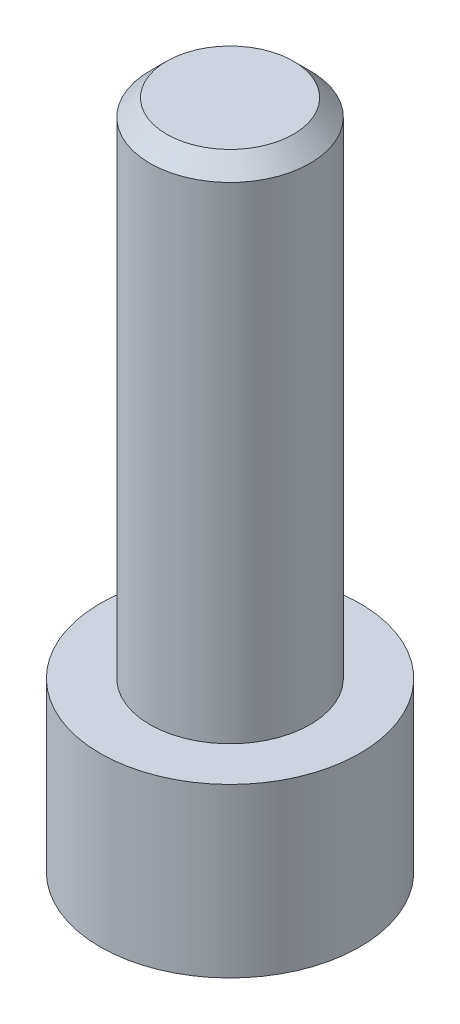
ISO-10303-21;
HEADER;
FILE_DESCRIPTION(('STEP AP214'),'2;1');
FILE_NAME('part.step','',(''),(''),'','','');
FILE_SCHEMA(('AUTOMOTIVE_DESIGN { 1 0 10303 214 1 1 1 1 }'));
ENDSEC;
DATA;
#1=APPLICATION_CONTEXT('core data for automotive mechanical design processes');
#2=APPLICATION_PROTOCOL_DEFINITION('international standard','automotive_design',2000,#1);
#3=PRODUCT_CONTEXT('',#1,'mechanical');
#4=PRODUCT('Part','Part','',(#3));
#5=PRODUCT_RELATED_PRODUCT_CATEGORY('part','',(#4));
#6=PRODUCT_DEFINITION_FORMATION('','',#4);
#7=PRODUCT_DEFINITION_CONTEXT('part definition',#1,'design');
#8=PRODUCT_DEFINITION('design','',#6,#7);
#9=PRODUCT_DEFINITION_SHAPE('','',#8);
#10=(LENGTH_UNIT() NAMED_UNIT(*) SI_UNIT(.MILLI.,.METRE.));
#11=(NAMED_UNIT(*) PLANE_ANGLE_UNIT() SI_UNIT($,.RADIAN.));
#12=(NAMED_UNIT(*) SI_UNIT($,.STERADIAN.) SOLID_ANGLE_UNIT());
#13=UNCERTAINTY_MEASURE_WITH_UNIT(LENGTH_MEASURE(1.E-05),#10,'distance_accuracy_value','');
#14=(GEOMETRIC_REPRESENTATION_CONTEXT(3) GLOBAL_UNCERTAINTY_ASSIGNED_CONTEXT((#13)) GLOBAL_UNIT_ASSIGNED_CONTEXT((#10,
#11,#12)) REPRESENTATION_CONTEXT('',''));
#15=CARTESIAN_POINT('',(0.,0.,0.));
#16=DIRECTION('',(0.,0.,1.));
#17=DIRECTION('',(1.,0.,0.));
#18=AXIS2_PLACEMENT_3D('',#15,#16,#17);
#19=CARTESIAN_POINT('',(0.,20.,0.));
#20=DIRECTION('',(0.,-1.,0.));
#21=DIRECTION('',(0.,0.,-1.));
#22=AXIS2_PLACEMENT_3D('',#19,#20,#21);
#23=CYLINDRICAL_SURFACE('',#22,3.875);
#24=CARTESIAN_POINT('',(0.,0.,0.));
#25=DIRECTION('',(0.,1.,0.));
#26=DIRECTION('',(0.,0.,1.));
#27=AXIS2_PLACEMENT_3D('',#24,#25,#26);
#28=CIRCLE('',#27,3.875);
#29=CARTESIAN_POINT('',(0.,0.,3.875));
#30=VERTEX_POINT('',#29);
#31=EDGE_CURVE('E145',#30,#30,#28,.T.);
#32=ORIENTED_EDGE('',*,*,#31,.T.);
#33=EDGE_LOOP('',(#32));
#34=FACE_BOUND('',#33,.T.);
#35=CARTESIAN_POINT('',(0.,5.,0.));
#36=DIRECTION('',(0.,1.,0.));
#37=DIRECTION('',(0.,0.,1.));
#38=AXIS2_PLACEMENT_3D('',#35,#36,#37);
#39=CIRCLE('',#38,3.875);
#40=CARTESIAN_POINT('',(0.,5.,3.875));
#41=VERTEX_POINT('',#40);
#42=EDGE_CURVE('E144',#41,#41,#39,.T.);
#43=ORIENTED_EDGE('',*,*,#42,.F.);
#44=EDGE_LOOP('',(#43));
#45=FACE_BOUND('',#44,.T.);
#46=ADVANCED_FACE('F34',(#34,#45),#23,.T.);
#47=CARTESIAN_POINT('',(0.,0.,0.));
#48=DIRECTION('',(0.,1.,0.));
#49=DIRECTION('',(0.,0.,1.));
#50=AXIS2_PLACEMENT_3D('',#47,#48,#49);
#51=PLANE('',#50);
#52=DIRECTION('',(-0.5,0.,0.866025403784439));
#53=VECTOR('',#52,1.);
#54=CARTESIAN_POINT('',(2.64426423288849,0.,0.));
#55=LINE('',#54,#53);
#56=CARTESIAN_POINT('',(2.64426423288849,0.,0.));
#57=VERTEX_POINT('',#56);
#58=CARTESIAN_POINT('',(1.32213211644424,0.,2.29));
#59=VERTEX_POINT('',#58);
#60=EDGE_CURVE('E123',#57,#59,#55,.T.);
#61=ORIENTED_EDGE('',*,*,#60,.F.);
#62=DIRECTION('',(0.5,0.,0.866025403784439));
#63=VECTOR('',#62,1.);
#64=CARTESIAN_POINT('',(1.32213211644424,0.,-2.29));
#65=LINE('',#64,#63);
#66=CARTESIAN_POINT('',(1.32213211644424,0.,-2.29));
#67=VERTEX_POINT('',#66);
#68=EDGE_CURVE('E49',#67,#57,#65,.T.);
#69=ORIENTED_EDGE('',*,*,#68,.F.);
#70=DIRECTION('',(1.,0.,0.));
#71=VECTOR('',#70,1.);
#72=CARTESIAN_POINT('',(-1.32213211644424,0.,-2.29));
#73=LINE('',#72,#71);
#74=CARTESIAN_POINT('',(-1.32213211644424,0.,-2.29));
#75=VERTEX_POINT('',#74);
#76=EDGE_CURVE('E132',#75,#67,#73,.T.);
#77=ORIENTED_EDGE('',*,*,#76,.F.);
#78=DIRECTION('',(0.5,0.,-0.866025403784439));
#79=VECTOR('',#78,1.);
#80=CARTESIAN_POINT('',(-2.64426423288849,0.,0.));
#81=LINE('',#80,#79);
#82=CARTESIAN_POINT('',(-2.64426423288849,0.,0.));
#83=VERTEX_POINT('',#82);
#84=EDGE_CURVE('E130',#83,#75,#81,.T.);
#85=ORIENTED_EDGE('',*,*,#84,.F.);
#86=DIRECTION('',(-0.5,0.,-0.866025403784439));
#87=VECTOR('',#86,1.);
#88=CARTESIAN_POINT('',(-1.32213211644424,0.,2.29));
#89=LINE('',#88,#87);
#90=CARTESIAN_POINT('',(-1.32213211644424,0.,2.29));
#91=VERTEX_POINT('',#90);
#92=EDGE_CURVE('E97',#91,#83,#89,.T.);
#93=ORIENTED_EDGE('',*,*,#92,.F.);
#94=DIRECTION('',(-1.,0.,0.));
#95=VECTOR('',#94,1.);
#96=CARTESIAN_POINT('',(1.32213211644424,0.,2.29));
#97=LINE('',#96,#95);
#98=EDGE_CURVE('E126',#59,#91,#97,.T.);
#99=ORIENTED_EDGE('',*,*,#98,.F.);
#100=EDGE_LOOP('',(#61,#69,#77,#85,#93,#99));
#101=FACE_BOUND('',#100,.T.);
#102=ORIENTED_EDGE('',*,*,#31,.F.);
#103=EDGE_LOOP('',(#102));
#104=FACE_BOUND('',#103,.T.);
#105=ADVANCED_FACE('F167',(#101,#104),#51,.F.);
#106=CARTESIAN_POINT('',(0.,5.,0.));
#107=DIRECTION('',(0.,1.,0.));
#108=DIRECTION('',(0.,0.,1.));
#109=AXIS2_PLACEMENT_3D('',#106,#107,#108);
#110=PLANE('',#109);
#111=CARTESIAN_POINT('',(0.,5.,0.));
#112=DIRECTION('',(0.,1.,0.));
#113=DIRECTION('',(0.,0.,1.));
#114=AXIS2_PLACEMENT_3D('',#111,#112,#113);
#115=CIRCLE('',#114,2.39);
#116=CARTESIAN_POINT('',(0.,5.,2.39));
#117=VERTEX_POINT('',#116);
#118=EDGE_CURVE('E136',#117,#117,#115,.T.);
#119=ORIENTED_EDGE('',*,*,#118,.F.);
#120=EDGE_LOOP('',(#119));
#121=FACE_BOUND('',#120,.T.);
#122=ORIENTED_EDGE('',*,*,#42,.T.);
#123=EDGE_LOOP('',(#122));
#124=FACE_BOUND('',#123,.T.);
#125=ADVANCED_FACE('F172',(#121,#124),#110,.T.);
#126=CARTESIAN_POINT('',(0.,5.,0.));
#127=DIRECTION('',(0.,1.,0.));
#128=DIRECTION('',(0.,0.,1.));
#129=AXIS2_PLACEMENT_3D('',#126,#127,#128);
#130=CYLINDRICAL_SURFACE('',#129,2.39);
#131=CARTESIAN_POINT('',(0.,19.5,0.));
#132=DIRECTION('',(0.,1.,0.));
#133=DIRECTION('',(0.,0.,1.));
#134=AXIS2_PLACEMENT_3D('',#131,#132,#133);
#135=CIRCLE('',#134,2.39);
#136=CARTESIAN_POINT('',(0.,19.5,2.39));
#137=VERTEX_POINT('',#136);
#138=EDGE_CURVE('E12',#137,#137,#135,.F.);
#139=ORIENTED_EDGE('',*,*,#138,.T.);
#140=EDGE_LOOP('',(#139));
#141=FACE_BOUND('',#140,.T.);
#142=ORIENTED_EDGE('',*,*,#118,.T.);
#143=EDGE_LOOP('',(#142));
#144=FACE_BOUND('',#143,.T.);
#145=ADVANCED_FACE('F163',(#141,#144),#130,.T.);
#146=CARTESIAN_POINT('',(0.,20.,0.));
#147=DIRECTION('',(0.,1.,0.));
#148=DIRECTION('',(0.,0.,1.));
#149=AXIS2_PLACEMENT_3D('',#146,#147,#148);
#150=PLANE('',#149);
#151=CARTESIAN_POINT('',(0.,20.,0.));
#152=DIRECTION('',(0.,1.,0.));
#153=DIRECTION('',(0.,0.,1.));
#154=AXIS2_PLACEMENT_3D('',#151,#152,#153);
#155=CIRCLE('',#154,1.89);
#156=CARTESIAN_POINT('',(0.,20.,1.89));
#157=VERTEX_POINT('',#156);
#158=EDGE_CURVE('E42',#157,#157,#155,.T.);
#159=ORIENTED_EDGE('',*,*,#158,.T.);
#160=EDGE_LOOP('',(#159));
#161=FACE_BOUND('',#160,.T.);
#162=ADVANCED_FACE('F152',(#161),#150,.T.);
#163=CARTESIAN_POINT('',(0.,20.,0.));
#164=DIRECTION('',(0.,-1.,0.));
#165=DIRECTION('',(0.,0.,-1.));
#166=AXIS2_PLACEMENT_3D('',#163,#164,#165);
#167=CONICAL_SURFACE('',#166,1.89,0.785398163397442);
#168=ORIENTED_EDGE('',*,*,#138,.F.);
#169=EDGE_LOOP('',(#168));
#170=FACE_BOUND('',#169,.T.);
#171=ORIENTED_EDGE('',*,*,#158,.F.);
#172=EDGE_LOOP('',(#171));
#173=FACE_BOUND('',#172,.T.);
#174=ADVANCED_FACE('F36',(#170,#173),#167,.T.);
#175=CARTESIAN_POINT('',(1.32213211644424,3.36,-2.29));
#176=DIRECTION('',(0.866025403784439,0.,-0.5));
#177=DIRECTION('',(-0.5,0.,-0.866025403784439));
#178=AXIS2_PLACEMENT_3D('',#175,#176,#177);
#179=PLANE('',#178);
#180=ORIENTED_EDGE('',*,*,#68,.T.);
#181=DIRECTION('',(0.,-1.,0.));
#182=VECTOR('',#181,1.);
#183=CARTESIAN_POINT('',(2.64426423288849,3.36,0.));
#184=LINE('',#183,#182);
#185=CARTESIAN_POINT('',(2.64426423288849,3.36,0.));
#186=VERTEX_POINT('',#185);
#187=EDGE_CURVE('E79',#186,#57,#184,.T.);
#188=ORIENTED_EDGE('',*,*,#187,.F.);
#189=DIRECTION('',(0.5,0.,0.866025403784439));
#190=VECTOR('',#189,1.);
#191=CARTESIAN_POINT('',(1.32213211644424,3.36,-2.29));
#192=LINE('',#191,#190);
#193=CARTESIAN_POINT('',(1.32213211644424,3.36,-2.29));
#194=VERTEX_POINT('',#193);
#195=EDGE_CURVE('E134',#194,#186,#192,.T.);
#196=ORIENTED_EDGE('',*,*,#195,.F.);
#197=DIRECTION('',(0.,-1.,0.));
#198=VECTOR('',#197,1.);
#199=CARTESIAN_POINT('',(1.32213211644424,3.36,-2.29));
#200=LINE('',#199,#198);
#201=EDGE_CURVE('E57',#194,#67,#200,.T.);
#202=ORIENTED_EDGE('',*,*,#201,.T.);
#203=EDGE_LOOP('',(#180,#188,#196,#202));
#204=FACE_BOUND('',#203,.T.);
#205=ADVANCED_FACE('F155',(#204),#179,.F.);
#206=CARTESIAN_POINT('',(-1.32213211644424,3.36,-2.29));
#207=DIRECTION('',(0.,0.,-1.));
#208=DIRECTION('',(-1.,0.,0.));
#209=AXIS2_PLACEMENT_3D('',#206,#207,#208);
#210=PLANE('',#209);
#211=ORIENTED_EDGE('',*,*,#76,.T.);
#212=ORIENTED_EDGE('',*,*,#201,.F.);
#213=DIRECTION('',(1.,0.,0.));
#214=VECTOR('',#213,1.);
#215=CARTESIAN_POINT('',(-1.32213211644424,3.36,-2.29));
#216=LINE('',#215,#214);
#217=CARTESIAN_POINT('',(-1.32213211644424,3.36,-2.29));
#218=VERTEX_POINT('',#217);
#219=EDGE_CURVE('E109',#218,#194,#216,.T.);
#220=ORIENTED_EDGE('',*,*,#219,.F.);
#221=DIRECTION('',(0.,-1.,0.));
#222=VECTOR('',#221,1.);
#223=CARTESIAN_POINT('',(-1.32213211644424,3.36,-2.29));
#224=LINE('',#223,#222);
#225=EDGE_CURVE('E101',#218,#75,#224,.T.);
#226=ORIENTED_EDGE('',*,*,#225,.T.);
#227=EDGE_LOOP('',(#211,#212,#220,#226));
#228=FACE_BOUND('',#227,.T.);
#229=ADVANCED_FACE('F161',(#228),#210,.F.);
#230=CARTESIAN_POINT('',(-2.64426423288849,3.36,0.));
#231=DIRECTION('',(-0.866025403784438,0.,-0.5));
#232=DIRECTION('',(-0.5,0.,0.866025403784439));
#233=AXIS2_PLACEMENT_3D('',#230,#231,#232);
#234=PLANE('',#233);
#235=ORIENTED_EDGE('',*,*,#84,.T.);
#236=ORIENTED_EDGE('',*,*,#225,.F.);
#237=DIRECTION('',(0.5,0.,-0.866025403784439));
#238=VECTOR('',#237,1.);
#239=CARTESIAN_POINT('',(-2.64426423288849,3.36,0.));
#240=LINE('',#239,#238);
#241=CARTESIAN_POINT('',(-2.64426423288849,3.36,0.));
#242=VERTEX_POINT('',#241);
#243=EDGE_CURVE('E105',#242,#218,#240,.T.);
#244=ORIENTED_EDGE('',*,*,#243,.F.);
#245=DIRECTION('',(0.,-1.,0.));
#246=VECTOR('',#245,1.);
#247=CARTESIAN_POINT('',(-2.64426423288849,3.36,0.));
#248=LINE('',#247,#246);
#249=EDGE_CURVE('E90',#242,#83,#248,.T.);
#250=ORIENTED_EDGE('',*,*,#249,.T.);
#251=EDGE_LOOP('',(#235,#236,#244,#250));
#252=FACE_BOUND('',#251,.T.);
#253=ADVANCED_FACE('F106',(#252),#234,.F.);
#254=CARTESIAN_POINT('',(-1.32213211644424,3.36,2.29));
#255=DIRECTION('',(-0.866025403784439,0.,0.5));
#256=DIRECTION('',(0.5,0.,0.866025403784439));
#257=AXIS2_PLACEMENT_3D('',#254,#255,#256);
#258=PLANE('',#257);
#259=ORIENTED_EDGE('',*,*,#92,.T.);
#260=ORIENTED_EDGE('',*,*,#249,.F.);
#261=DIRECTION('',(-0.5,0.,-0.866025403784439));
#262=VECTOR('',#261,1.);
#263=CARTESIAN_POINT('',(-1.32213211644424,3.36,2.29));
#264=LINE('',#263,#262);
#265=CARTESIAN_POINT('',(-1.32213211644424,3.36,2.29));
#266=VERTEX_POINT('',#265);
#267=EDGE_CURVE('E94',#266,#242,#264,.T.);
#268=ORIENTED_EDGE('',*,*,#267,.F.);
#269=DIRECTION('',(0.,-1.,0.));
#270=VECTOR('',#269,1.);
#271=CARTESIAN_POINT('',(-1.32213211644424,3.36,2.29));
#272=LINE('',#271,#270);
#273=EDGE_CURVE('E102',#266,#91,#272,.T.);
#274=ORIENTED_EDGE('',*,*,#273,.T.);
#275=EDGE_LOOP('',(#259,#260,#268,#274));
#276=FACE_BOUND('',#275,.T.);
#277=ADVANCED_FACE('F92',(#276),#258,.F.);
#278=CARTESIAN_POINT('',(1.32213211644424,3.36,2.29));
#279=DIRECTION('',(0.,0.,1.));
#280=DIRECTION('',(1.,0.,0.));
#281=AXIS2_PLACEMENT_3D('',#278,#279,#280);
#282=PLANE('',#281);
#283=ORIENTED_EDGE('',*,*,#98,.T.);
#284=ORIENTED_EDGE('',*,*,#273,.F.);
#285=DIRECTION('',(-1.,0.,0.));
#286=VECTOR('',#285,1.);
#287=CARTESIAN_POINT('',(1.32213211644424,3.36,2.29));
#288=LINE('',#287,#286);
#289=CARTESIAN_POINT('',(1.32213211644424,3.36,2.29));
#290=VERTEX_POINT('',#289);
#291=EDGE_CURVE('E115',#290,#266,#288,.T.);
#292=ORIENTED_EDGE('',*,*,#291,.F.);
#293=DIRECTION('',(0.,-1.,0.));
#294=VECTOR('',#293,1.);
#295=CARTESIAN_POINT('',(1.32213211644424,3.36,2.29));
#296=LINE('',#295,#294);
#297=EDGE_CURVE('E139',#290,#59,#296,.T.);
#298=ORIENTED_EDGE('',*,*,#297,.T.);
#299=EDGE_LOOP('',(#283,#284,#292,#298));
#300=FACE_BOUND('',#299,.T.);
#301=ADVANCED_FACE('F186',(#300),#282,.F.);
#302=CARTESIAN_POINT('',(2.64426423288849,3.36,0.));
#303=DIRECTION('',(0.866025403784439,0.,0.5));
#304=DIRECTION('',(0.5,0.,-0.866025403784439));
#305=AXIS2_PLACEMENT_3D('',#302,#303,#304);
#306=PLANE('',#305);
#307=ORIENTED_EDGE('',*,*,#60,.T.);
#308=ORIENTED_EDGE('',*,*,#297,.F.);
#309=DIRECTION('',(-0.5,0.,0.866025403784439));
#310=VECTOR('',#309,1.);
#311=CARTESIAN_POINT('',(2.64426423288849,3.36,0.));
#312=LINE('',#311,#310);
#313=EDGE_CURVE('E117',#186,#290,#312,.T.);
#314=ORIENTED_EDGE('',*,*,#313,.F.);
#315=ORIENTED_EDGE('',*,*,#187,.T.);
#316=EDGE_LOOP('',(#307,#308,#314,#315));
#317=FACE_BOUND('',#316,.T.);
#318=ADVANCED_FACE('F183',(#317),#306,.F.);
#319=CARTESIAN_POINT('',(0.,3.36,0.));
#320=DIRECTION('',(0.,-1.,0.));
#321=DIRECTION('',(0.,0.,-1.));
#322=AXIS2_PLACEMENT_3D('',#319,#320,#321);
#323=PLANE('',#322);
#324=ORIENTED_EDGE('',*,*,#195,.T.);
#325=ORIENTED_EDGE('',*,*,#313,.T.);
#326=ORIENTED_EDGE('',*,*,#291,.T.);
#327=ORIENTED_EDGE('',*,*,#267,.T.);
#328=ORIENTED_EDGE('',*,*,#243,.T.);
#329=ORIENTED_EDGE('',*,*,#219,.T.);
#330=EDGE_LOOP('',(#324,#325,#326,#327,#328,#329));
#331=FACE_BOUND('',#330,.T.);
#332=ADVANCED_FACE('F112',(#331),#323,.T.);
#333=CLOSED_SHELL('',(#46,#105,#125,#145,#162,#174,#205,#229,#253,#277,#301,#318,#332));
#334=MANIFOLD_SOLID_BREP('B2',#333);
#335=ADVANCED_BREP_SHAPE_REPRESENTATION('',(#18,#334),#14);
#336=SHAPE_DEFINITION_REPRESENTATION(#9,#335);
ENDSEC;
END-ISO-10303-21;
